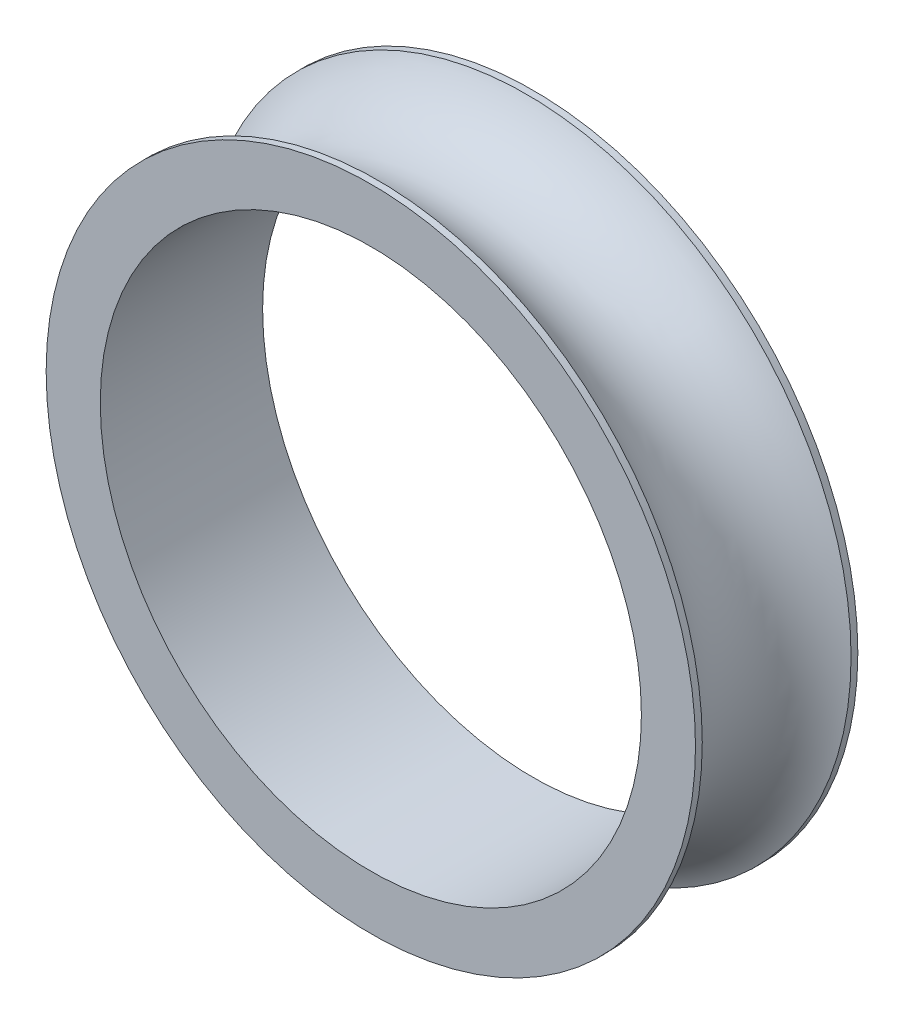
ISO-10303-21;
HEADER;
FILE_DESCRIPTION(('STEP AP214'),'2;1');
FILE_NAME('part.step','',(''),(''),'','','');
FILE_SCHEMA(('AUTOMOTIVE_DESIGN { 1 0 10303 214 1 1 1 1 }'));
ENDSEC;
DATA;
#1=APPLICATION_CONTEXT('core data for automotive mechanical design processes');
#2=APPLICATION_PROTOCOL_DEFINITION('international standard','automotive_design',2000,#1);
#3=PRODUCT_CONTEXT('',#1,'mechanical');
#4=PRODUCT('Part','Part','',(#3));
#5=PRODUCT_RELATED_PRODUCT_CATEGORY('part','',(#4));
#6=PRODUCT_DEFINITION_FORMATION('','',#4);
#7=PRODUCT_DEFINITION_CONTEXT('part definition',#1,'design');
#8=PRODUCT_DEFINITION('design','',#6,#7);
#9=PRODUCT_DEFINITION_SHAPE('','',#8);
#10=(LENGTH_UNIT() NAMED_UNIT(*) SI_UNIT(.MILLI.,.METRE.));
#11=(NAMED_UNIT(*) PLANE_ANGLE_UNIT() SI_UNIT($,.RADIAN.));
#12=(NAMED_UNIT(*) SI_UNIT($,.STERADIAN.) SOLID_ANGLE_UNIT());
#13=UNCERTAINTY_MEASURE_WITH_UNIT(LENGTH_MEASURE(1.E-05),#10,'distance_accuracy_value','');
#14=(GEOMETRIC_REPRESENTATION_CONTEXT(3) GLOBAL_UNCERTAINTY_ASSIGNED_CONTEXT((#13)) GLOBAL_UNIT_ASSIGNED_CONTEXT((#10,
#11,#12)) REPRESENTATION_CONTEXT('',''));
#15=CARTESIAN_POINT('',(0.,0.,0.));
#16=DIRECTION('',(0.,0.,1.));
#17=DIRECTION('',(1.,0.,0.));
#18=AXIS2_PLACEMENT_3D('',#15,#16,#17);
#19=CARTESIAN_POINT('',(0.,0.,29.245125));
#20=DIRECTION('',(0.,0.,-1.));
#21=DIRECTION('',(-1.,0.,0.));
#22=AXIS2_PLACEMENT_3D('',#19,#20,#21);
#23=CYLINDRICAL_SURFACE('',#22,86.9805);
#24=CARTESIAN_POINT('',(0.,0.,29.245125));
#25=DIRECTION('',(0.,0.,1.));
#26=DIRECTION('',(1.,0.,0.));
#27=AXIS2_PLACEMENT_3D('',#24,#25,#26);
#28=CIRCLE('',#27,86.9805);
#29=CARTESIAN_POINT('',(86.9805,0.,29.245125));
#30=VERTEX_POINT('',#29);
#31=EDGE_CURVE('E10',#30,#30,#28,.T.);
#32=ORIENTED_EDGE('',*,*,#31,.F.);
#33=EDGE_LOOP('',(#32));
#34=FACE_BOUND('',#33,.T.);
#35=CARTESIAN_POINT('',(0.,0.,27.4297362617553));
#36=DIRECTION('',(0.,0.,-1.));
#37=DIRECTION('',(-1.,0.,0.));
#38=AXIS2_PLACEMENT_3D('',#35,#36,#37);
#39=CIRCLE('',#38,86.9805);
#40=CARTESIAN_POINT('',(-86.9805,0.,27.4297362617553));
#41=VERTEX_POINT('',#40);
#42=EDGE_CURVE('E35',#41,#41,#39,.T.);
#43=ORIENTED_EDGE('',*,*,#42,.F.);
#44=EDGE_LOOP('',(#43));
#45=FACE_BOUND('',#44,.T.);
#46=ADVANCED_FACE('F32',(#34,#45),#23,.T.);
#47=CARTESIAN_POINT('',(0.,0.,-14.245125));
#48=DIRECTION('',(0.,0.,1.));
#49=DIRECTION('',(1.,0.,0.));
#50=AXIS2_PLACEMENT_3D('',#47,#48,#49);
#51=CIRCLE('',#50,86.9805);
#52=CARTESIAN_POINT('',(86.9805,0.,-14.245125));
#53=VERTEX_POINT('',#52);
#54=EDGE_CURVE('E39',#53,#53,#51,.T.);
#55=ORIENTED_EDGE('',*,*,#54,.T.);
#56=EDGE_LOOP('',(#55));
#57=FACE_BOUND('',#56,.T.);
#58=CARTESIAN_POINT('',(0.,0.,-12.4297362617553));
#59=DIRECTION('',(0.,0.,1.));
#60=DIRECTION('',(1.,0.,0.));
#61=AXIS2_PLACEMENT_3D('',#58,#59,#60);
#62=CIRCLE('',#61,86.9805);
#63=CARTESIAN_POINT('',(86.9805,0.,-12.4297362617553));
#64=VERTEX_POINT('',#63);
#65=EDGE_CURVE('E49',#64,#64,#62,.T.);
#66=ORIENTED_EDGE('',*,*,#65,.F.);
#67=EDGE_LOOP('',(#66));
#68=FACE_BOUND('',#67,.T.);
#69=ADVANCED_FACE('F68',(#57,#68),#23,.T.);
#70=CARTESIAN_POINT('',(0.,0.,29.245125));
#71=DIRECTION('',(0.,0.,1.));
#72=DIRECTION('',(1.,0.,0.));
#73=AXIS2_PLACEMENT_3D('',#70,#71,#72);
#74=PLANE('',#73);
#75=ORIENTED_EDGE('',*,*,#31,.T.);
#76=EDGE_LOOP('',(#75));
#77=FACE_BOUND('',#76,.T.);
#78=CARTESIAN_POINT('',(0.,0.,29.245125));
#79=DIRECTION('',(0.,0.,1.));
#80=DIRECTION('',(1.,0.,0.));
#81=AXIS2_PLACEMENT_3D('',#78,#79,#80);
#82=CIRCLE('',#81,72.48375);
#83=CARTESIAN_POINT('',(72.48375,0.,29.245125));
#84=VERTEX_POINT('',#83);
#85=EDGE_CURVE('E44',#84,#84,#82,.T.);
#86=ORIENTED_EDGE('',*,*,#85,.F.);
#87=EDGE_LOOP('',(#86));
#88=FACE_BOUND('',#87,.T.);
#89=ADVANCED_FACE('F65',(#77,#88),#74,.T.);
#90=CARTESIAN_POINT('',(0.,0.,-14.245125));
#91=DIRECTION('',(0.,0.,1.));
#92=DIRECTION('',(1.,0.,0.));
#93=AXIS2_PLACEMENT_3D('',#90,#91,#92);
#94=PLANE('',#93);
#95=ORIENTED_EDGE('',*,*,#54,.F.);
#96=EDGE_LOOP('',(#95));
#97=FACE_BOUND('',#96,.T.);
#98=CARTESIAN_POINT('',(0.,0.,-14.245125));
#99=DIRECTION('',(0.,0.,1.));
#100=DIRECTION('',(1.,0.,0.));
#101=AXIS2_PLACEMENT_3D('',#98,#99,#100);
#102=CIRCLE('',#101,72.48375);
#103=CARTESIAN_POINT('',(72.48375,0.,-14.245125));
#104=VERTEX_POINT('',#103);
#105=EDGE_CURVE('E47',#104,#104,#102,.T.);
#106=ORIENTED_EDGE('',*,*,#105,.T.);
#107=EDGE_LOOP('',(#106));
#108=FACE_BOUND('',#107,.T.);
#109=ADVANCED_FACE('F67',(#97,#108),#94,.F.);
#110=CARTESIAN_POINT('',(0.,0.,29.245125));
#111=DIRECTION('',(0.,0.,-1.));
#112=DIRECTION('',(-1.,0.,0.));
#113=AXIS2_PLACEMENT_3D('',#110,#111,#112);
#114=CYLINDRICAL_SURFACE('',#113,72.48375);
#115=ORIENTED_EDGE('',*,*,#85,.T.);
#116=EDGE_LOOP('',(#115));
#117=FACE_BOUND('',#116,.T.);
#118=ORIENTED_EDGE('',*,*,#105,.F.);
#119=EDGE_LOOP('',(#118));
#120=FACE_BOUND('',#119,.T.);
#121=ADVANCED_FACE('F62',(#117,#120),#114,.F.);
#122=CARTESIAN_POINT('',(0.,0.,7.49999999999999));
#123=DIRECTION('',(0.,0.,1.));
#124=DIRECTION('',(1.,0.,0.));
#125=AXIS2_PLACEMENT_3D('',#122,#123,#124);
#126=TOROIDAL_SURFACE('',#125,95.67855,21.745125);
#127=ORIENTED_EDGE('',*,*,#65,.T.);
#128=EDGE_LOOP('',(#127));
#129=FACE_BOUND('',#128,.T.);
#130=ORIENTED_EDGE('',*,*,#42,.T.);
#131=EDGE_LOOP('',(#130));
#132=FACE_BOUND('',#131,.T.);
#133=ADVANCED_FACE('F105',(#129,#132),#126,.F.);
#134=CLOSED_SHELL('',(#46,#69,#89,#109,#121,#133));
#135=MANIFOLD_SOLID_BREP('B2',#134);
#136=ADVANCED_BREP_SHAPE_REPRESENTATION('',(#18,#135),#14);
#137=SHAPE_DEFINITION_REPRESENTATION(#9,#136);
ENDSEC;
END-ISO-10303-21;
